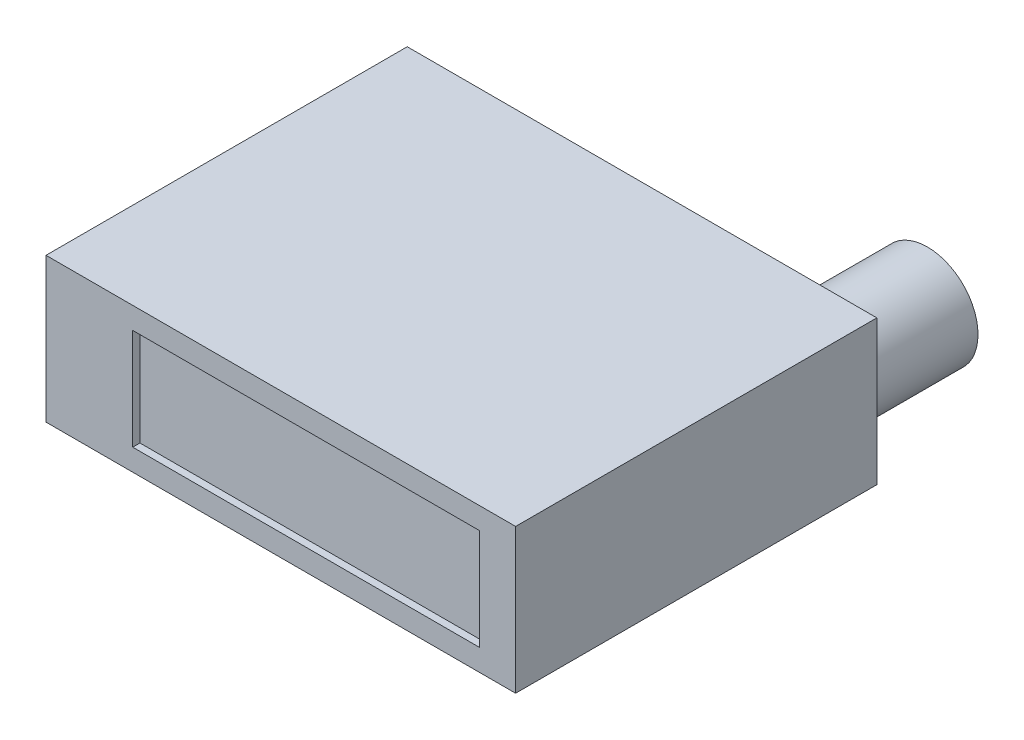
ISO-10303-21;
HEADER;
FILE_DESCRIPTION(('STEP AP214'),'2;1');
FILE_NAME('part.step','',(''),(''),'','','');
FILE_SCHEMA(('AUTOMOTIVE_DESIGN { 1 0 10303 214 1 1 1 1 }'));
ENDSEC;
DATA;
#1=APPLICATION_CONTEXT('core data for automotive mechanical design processes');
#2=APPLICATION_PROTOCOL_DEFINITION('international standard','automotive_design',2000,#1);
#3=PRODUCT_CONTEXT('',#1,'mechanical');
#4=PRODUCT('Part','Part','',(#3));
#5=PRODUCT_RELATED_PRODUCT_CATEGORY('part','',(#4));
#6=PRODUCT_DEFINITION_FORMATION('','',#4);
#7=PRODUCT_DEFINITION_CONTEXT('part definition',#1,'design');
#8=PRODUCT_DEFINITION('design','',#6,#7);
#9=PRODUCT_DEFINITION_SHAPE('','',#8);
#10=(LENGTH_UNIT() NAMED_UNIT(*) SI_UNIT(.MILLI.,.METRE.));
#11=(NAMED_UNIT(*) PLANE_ANGLE_UNIT() SI_UNIT($,.RADIAN.));
#12=(NAMED_UNIT(*) SI_UNIT($,.STERADIAN.) SOLID_ANGLE_UNIT());
#13=UNCERTAINTY_MEASURE_WITH_UNIT(LENGTH_MEASURE(1.E-05),#10,'distance_accuracy_value','');
#14=(GEOMETRIC_REPRESENTATION_CONTEXT(3) GLOBAL_UNCERTAINTY_ASSIGNED_CONTEXT((#13)) GLOBAL_UNIT_ASSIGNED_CONTEXT((#10,
#11,#12)) REPRESENTATION_CONTEXT('',''));
#15=CARTESIAN_POINT('',(0.,0.,0.));
#16=DIRECTION('',(0.,0.,1.));
#17=DIRECTION('',(1.,0.,0.));
#18=AXIS2_PLACEMENT_3D('',#15,#16,#17);
#19=CARTESIAN_POINT('',(32.5,20.,-25.));
#20=DIRECTION('',(-1.,0.,0.));
#21=DIRECTION('',(0.,0.,1.));
#22=AXIS2_PLACEMENT_3D('',#19,#20,#21);
#23=PLANE('',#22);
#24=DIRECTION('',(0.,0.,-1.));
#25=VECTOR('',#24,1.);
#26=CARTESIAN_POINT('',(32.5,0.,-25.));
#27=LINE('',#26,#25);
#28=CARTESIAN_POINT('',(32.5,0.,25.));
#29=VERTEX_POINT('',#28);
#30=CARTESIAN_POINT('',(32.5,0.,-25.));
#31=VERTEX_POINT('',#30);
#32=EDGE_CURVE('E170',#29,#31,#27,.T.);
#33=ORIENTED_EDGE('',*,*,#32,.T.);
#34=DIRECTION('',(0.,-1.,0.));
#35=VECTOR('',#34,1.);
#36=CARTESIAN_POINT('',(32.5,20.,-25.));
#37=LINE('',#36,#35);
#38=CARTESIAN_POINT('',(32.5,20.,-25.));
#39=VERTEX_POINT('',#38);
#40=EDGE_CURVE('E49',#39,#31,#37,.T.);
#41=ORIENTED_EDGE('',*,*,#40,.F.);
#42=DIRECTION('',(0.,0.,-1.));
#43=VECTOR('',#42,1.);
#44=CARTESIAN_POINT('',(32.5,20.,-25.));
#45=LINE('',#44,#43);
#46=CARTESIAN_POINT('',(32.5,20.,25.));
#47=VERTEX_POINT('',#46);
#48=EDGE_CURVE('E171',#47,#39,#45,.T.);
#49=ORIENTED_EDGE('',*,*,#48,.F.);
#50=DIRECTION('',(0.,-1.,0.));
#51=VECTOR('',#50,1.);
#52=CARTESIAN_POINT('',(32.5,20.,25.));
#53=LINE('',#52,#51);
#54=EDGE_CURVE('E181',#47,#29,#53,.T.);
#55=ORIENTED_EDGE('',*,*,#54,.T.);
#56=EDGE_LOOP('',(#33,#41,#49,#55));
#57=FACE_BOUND('',#56,.T.);
#58=ADVANCED_FACE('F41',(#57),#23,.F.);
#59=CARTESIAN_POINT('',(-32.5,20.,-25.));
#60=DIRECTION('',(0.,0.,1.));
#61=DIRECTION('',(1.,0.,0.));
#62=AXIS2_PLACEMENT_3D('',#59,#60,#61);
#63=PLANE('',#62);
#64=CARTESIAN_POINT('',(24.5,10.,-25.));
#65=DIRECTION('',(0.,0.,1.));
#66=DIRECTION('',(1.,0.,0.));
#67=AXIS2_PLACEMENT_3D('',#64,#65,#66);
#68=CIRCLE('',#67,7.);
#69=CARTESIAN_POINT('',(31.5,10.,-25.));
#70=VERTEX_POINT('',#69);
#71=EDGE_CURVE('E11',#70,#70,#68,.F.);
#72=ORIENTED_EDGE('',*,*,#71,.F.);
#73=EDGE_LOOP('',(#72));
#74=FACE_BOUND('',#73,.T.);
#75=DIRECTION('',(-1.,0.,0.));
#76=VECTOR('',#75,1.);
#77=CARTESIAN_POINT('',(-32.5,0.,-25.));
#78=LINE('',#77,#76);
#79=CARTESIAN_POINT('',(-32.5,0.,-25.));
#80=VERTEX_POINT('',#79);
#81=EDGE_CURVE('E185',#31,#80,#78,.T.);
#82=ORIENTED_EDGE('',*,*,#81,.T.);
#83=DIRECTION('',(0.,-1.,0.));
#84=VECTOR('',#83,1.);
#85=CARTESIAN_POINT('',(-32.5,20.,-25.));
#86=LINE('',#85,#84);
#87=CARTESIAN_POINT('',(-32.5,20.,-25.));
#88=VERTEX_POINT('',#87);
#89=EDGE_CURVE('E198',#88,#80,#86,.T.);
#90=ORIENTED_EDGE('',*,*,#89,.F.);
#91=DIRECTION('',(-1.,0.,0.));
#92=VECTOR('',#91,1.);
#93=CARTESIAN_POINT('',(-32.5,20.,-25.));
#94=LINE('',#93,#92);
#95=EDGE_CURVE('E94',#39,#88,#94,.T.);
#96=ORIENTED_EDGE('',*,*,#95,.F.);
#97=ORIENTED_EDGE('',*,*,#40,.T.);
#98=EDGE_LOOP('',(#82,#90,#96,#97));
#99=FACE_BOUND('',#98,.T.);
#100=ADVANCED_FACE('F203',(#74,#99),#63,.F.);
#101=CARTESIAN_POINT('',(-32.5,20.,-25.));
#102=DIRECTION('',(1.,0.,0.));
#103=DIRECTION('',(0.,0.,-1.));
#104=AXIS2_PLACEMENT_3D('',#101,#102,#103);
#105=PLANE('',#104);
#106=DIRECTION('',(0.,0.,1.));
#107=VECTOR('',#106,1.);
#108=CARTESIAN_POINT('',(-32.5,0.,-25.));
#109=LINE('',#108,#107);
#110=CARTESIAN_POINT('',(-32.5,0.,25.));
#111=VERTEX_POINT('',#110);
#112=EDGE_CURVE('E188',#80,#111,#109,.T.);
#113=ORIENTED_EDGE('',*,*,#112,.T.);
#114=DIRECTION('',(0.,-1.,0.));
#115=VECTOR('',#114,1.);
#116=CARTESIAN_POINT('',(-32.5,20.,25.));
#117=LINE('',#116,#115);
#118=CARTESIAN_POINT('',(-32.5,20.,25.));
#119=VERTEX_POINT('',#118);
#120=EDGE_CURVE('E195',#119,#111,#117,.T.);
#121=ORIENTED_EDGE('',*,*,#120,.F.);
#122=DIRECTION('',(0.,0.,1.));
#123=VECTOR('',#122,1.);
#124=CARTESIAN_POINT('',(-32.5,20.,-25.));
#125=LINE('',#124,#123);
#126=EDGE_CURVE('E176',#88,#119,#125,.T.);
#127=ORIENTED_EDGE('',*,*,#126,.F.);
#128=ORIENTED_EDGE('',*,*,#89,.T.);
#129=EDGE_LOOP('',(#113,#121,#127,#128));
#130=FACE_BOUND('',#129,.T.);
#131=ADVANCED_FACE('F212',(#130),#105,.F.);
#132=CARTESIAN_POINT('',(-32.5,20.,25.));
#133=DIRECTION('',(0.,0.,-1.));
#134=DIRECTION('',(-1.,0.,0.));
#135=AXIS2_PLACEMENT_3D('',#132,#133,#134);
#136=PLANE('',#135);
#137=DIRECTION('',(-1.,0.,0.));
#138=VECTOR('',#137,1.);
#139=CARTESIAN_POINT('',(-20.5,17.,25.));
#140=LINE('',#139,#138);
#141=CARTESIAN_POINT('',(27.5,17.,25.));
#142=VERTEX_POINT('',#141);
#143=CARTESIAN_POINT('',(-20.5,17.,25.));
#144=VERTEX_POINT('',#143);
#145=EDGE_CURVE('E152',#142,#144,#140,.T.);
#146=ORIENTED_EDGE('',*,*,#145,.F.);
#147=DIRECTION('',(0.,1.,0.));
#148=VECTOR('',#147,1.);
#149=CARTESIAN_POINT('',(27.5,17.,25.));
#150=LINE('',#149,#148);
#151=CARTESIAN_POINT('',(27.5,3.,25.));
#152=VERTEX_POINT('',#151);
#153=EDGE_CURVE('E56',#152,#142,#150,.T.);
#154=ORIENTED_EDGE('',*,*,#153,.F.);
#155=DIRECTION('',(1.,0.,0.));
#156=VECTOR('',#155,1.);
#157=CARTESIAN_POINT('',(-20.5,3.,25.));
#158=LINE('',#157,#156);
#159=CARTESIAN_POINT('',(-20.5,3.,25.));
#160=VERTEX_POINT('',#159);
#161=EDGE_CURVE('E139',#160,#152,#158,.T.);
#162=ORIENTED_EDGE('',*,*,#161,.F.);
#163=DIRECTION('',(0.,-1.,0.));
#164=VECTOR('',#163,1.);
#165=CARTESIAN_POINT('',(-20.5,17.,25.));
#166=LINE('',#165,#164);
#167=EDGE_CURVE('E143',#144,#160,#166,.T.);
#168=ORIENTED_EDGE('',*,*,#167,.F.);
#169=EDGE_LOOP('',(#146,#154,#162,#168));
#170=FACE_BOUND('',#169,.T.);
#171=DIRECTION('',(1.,0.,0.));
#172=VECTOR('',#171,1.);
#173=CARTESIAN_POINT('',(-32.5,0.,25.));
#174=LINE('',#173,#172);
#175=EDGE_CURVE('E86',#111,#29,#174,.T.);
#176=ORIENTED_EDGE('',*,*,#175,.T.);
#177=ORIENTED_EDGE('',*,*,#54,.F.);
#178=DIRECTION('',(1.,0.,0.));
#179=VECTOR('',#178,1.);
#180=CARTESIAN_POINT('',(-32.5,20.,25.));
#181=LINE('',#180,#179);
#182=EDGE_CURVE('E65',#119,#47,#181,.T.);
#183=ORIENTED_EDGE('',*,*,#182,.F.);
#184=ORIENTED_EDGE('',*,*,#120,.T.);
#185=EDGE_LOOP('',(#176,#177,#183,#184));
#186=FACE_BOUND('',#185,.T.);
#187=ADVANCED_FACE('F214',(#170,#186),#136,.F.);
#188=CARTESIAN_POINT('',(0.,20.,0.));
#189=DIRECTION('',(0.,1.,0.));
#190=DIRECTION('',(0.,0.,1.));
#191=AXIS2_PLACEMENT_3D('',#188,#189,#190);
#192=PLANE('',#191);
#193=ORIENTED_EDGE('',*,*,#48,.T.);
#194=ORIENTED_EDGE('',*,*,#95,.T.);
#195=ORIENTED_EDGE('',*,*,#126,.T.);
#196=ORIENTED_EDGE('',*,*,#182,.T.);
#197=EDGE_LOOP('',(#193,#194,#195,#196));
#198=FACE_BOUND('',#197,.T.);
#199=ADVANCED_FACE('F215',(#198),#192,.T.);
#200=CARTESIAN_POINT('',(0.,0.,0.));
#201=DIRECTION('',(0.,1.,0.));
#202=DIRECTION('',(0.,0.,1.));
#203=AXIS2_PLACEMENT_3D('',#200,#201,#202);
#204=PLANE('',#203);
#205=ORIENTED_EDGE('',*,*,#32,.F.);
#206=ORIENTED_EDGE('',*,*,#175,.F.);
#207=ORIENTED_EDGE('',*,*,#112,.F.);
#208=ORIENTED_EDGE('',*,*,#81,.F.);
#209=EDGE_LOOP('',(#205,#206,#207,#208));
#210=FACE_BOUND('',#209,.T.);
#211=ADVANCED_FACE('F208',(#210),#204,.F.);
#212=CARTESIAN_POINT('',(24.5,10.,-40.));
#213=DIRECTION('',(0.,0.,1.));
#214=DIRECTION('',(1.,0.,0.));
#215=AXIS2_PLACEMENT_3D('',#212,#213,#214);
#216=CYLINDRICAL_SURFACE('',#215,7.);
#217=CARTESIAN_POINT('',(24.5,10.,-40.));
#218=DIRECTION('',(0.,0.,-1.));
#219=DIRECTION('',(-1.,0.,0.));
#220=AXIS2_PLACEMENT_3D('',#217,#218,#219);
#221=CIRCLE('',#220,7.);
#222=CARTESIAN_POINT('',(17.5,10.,-40.));
#223=VERTEX_POINT('',#222);
#224=EDGE_CURVE('E161',#223,#223,#221,.T.);
#225=ORIENTED_EDGE('',*,*,#224,.F.);
#226=EDGE_LOOP('',(#225));
#227=FACE_BOUND('',#226,.T.);
#228=ORIENTED_EDGE('',*,*,#71,.T.);
#229=EDGE_LOOP('',(#228));
#230=FACE_BOUND('',#229,.T.);
#231=ADVANCED_FACE('F222',(#227,#230),#216,.T.);
#232=CARTESIAN_POINT('',(24.5,10.,-40.));
#233=DIRECTION('',(0.,0.,-1.));
#234=DIRECTION('',(-1.,0.,0.));
#235=AXIS2_PLACEMENT_3D('',#232,#233,#234);
#236=PLANE('',#235);
#237=ORIENTED_EDGE('',*,*,#224,.T.);
#238=EDGE_LOOP('',(#237));
#239=FACE_BOUND('',#238,.T.);
#240=ADVANCED_FACE('F239',(#239),#236,.T.);
#241=CARTESIAN_POINT('',(27.5,17.,24.));
#242=DIRECTION('',(1.,0.,0.));
#243=DIRECTION('',(0.,0.,-1.));
#244=AXIS2_PLACEMENT_3D('',#241,#242,#243);
#245=PLANE('',#244);
#246=ORIENTED_EDGE('',*,*,#153,.T.);
#247=DIRECTION('',(0.,0.,1.));
#248=VECTOR('',#247,1.);
#249=CARTESIAN_POINT('',(27.5,17.,24.));
#250=LINE('',#249,#248);
#251=CARTESIAN_POINT('',(27.5,17.,24.));
#252=VERTEX_POINT('',#251);
#253=EDGE_CURVE('E114',#252,#142,#250,.T.);
#254=ORIENTED_EDGE('',*,*,#253,.F.);
#255=DIRECTION('',(0.,1.,0.));
#256=VECTOR('',#255,1.);
#257=CARTESIAN_POINT('',(27.5,17.,24.));
#258=LINE('',#257,#256);
#259=CARTESIAN_POINT('',(27.5,3.,24.));
#260=VERTEX_POINT('',#259);
#261=EDGE_CURVE('E118',#260,#252,#258,.T.);
#262=ORIENTED_EDGE('',*,*,#261,.F.);
#263=DIRECTION('',(0.,0.,1.));
#264=VECTOR('',#263,1.);
#265=CARTESIAN_POINT('',(27.5,3.,24.));
#266=LINE('',#265,#264);
#267=EDGE_CURVE('E158',#260,#152,#266,.T.);
#268=ORIENTED_EDGE('',*,*,#267,.T.);
#269=EDGE_LOOP('',(#246,#254,#262,#268));
#270=FACE_BOUND('',#269,.T.);
#271=ADVANCED_FACE('F116',(#270),#245,.F.);
#272=CARTESIAN_POINT('',(-20.5,3.,24.));
#273=DIRECTION('',(0.,-1.,0.));
#274=DIRECTION('',(0.,0.,-1.));
#275=AXIS2_PLACEMENT_3D('',#272,#273,#274);
#276=PLANE('',#275);
#277=ORIENTED_EDGE('',*,*,#161,.T.);
#278=ORIENTED_EDGE('',*,*,#267,.F.);
#279=DIRECTION('',(1.,0.,0.));
#280=VECTOR('',#279,1.);
#281=CARTESIAN_POINT('',(-20.5,3.,24.));
#282=LINE('',#281,#280);
#283=CARTESIAN_POINT('',(-20.5,3.,24.));
#284=VERTEX_POINT('',#283);
#285=EDGE_CURVE('E125',#284,#260,#282,.T.);
#286=ORIENTED_EDGE('',*,*,#285,.F.);
#287=DIRECTION('',(0.,0.,1.));
#288=VECTOR('',#287,1.);
#289=CARTESIAN_POINT('',(-20.5,3.,24.));
#290=LINE('',#289,#288);
#291=EDGE_CURVE('E162',#284,#160,#290,.T.);
#292=ORIENTED_EDGE('',*,*,#291,.T.);
#293=EDGE_LOOP('',(#277,#278,#286,#292));
#294=FACE_BOUND('',#293,.T.);
#295=ADVANCED_FACE('F250',(#294),#276,.F.);
#296=CARTESIAN_POINT('',(-20.5,17.,24.));
#297=DIRECTION('',(-1.,0.,0.));
#298=DIRECTION('',(0.,-1.,0.));
#299=AXIS2_PLACEMENT_3D('',#296,#297,#298);
#300=PLANE('',#299);
#301=ORIENTED_EDGE('',*,*,#167,.T.);
#302=ORIENTED_EDGE('',*,*,#291,.F.);
#303=DIRECTION('',(0.,-1.,0.));
#304=VECTOR('',#303,1.);
#305=CARTESIAN_POINT('',(-20.5,17.,24.));
#306=LINE('',#305,#304);
#307=CARTESIAN_POINT('',(-20.5,17.,24.));
#308=VERTEX_POINT('',#307);
#309=EDGE_CURVE('E134',#308,#284,#306,.T.);
#310=ORIENTED_EDGE('',*,*,#309,.F.);
#311=DIRECTION('',(0.,0.,1.));
#312=VECTOR('',#311,1.);
#313=CARTESIAN_POINT('',(-20.5,17.,24.));
#314=LINE('',#313,#312);
#315=EDGE_CURVE('E124',#308,#144,#314,.T.);
#316=ORIENTED_EDGE('',*,*,#315,.T.);
#317=EDGE_LOOP('',(#301,#302,#310,#316));
#318=FACE_BOUND('',#317,.T.);
#319=ADVANCED_FACE('F253',(#318),#300,.F.);
#320=CARTESIAN_POINT('',(-20.5,17.,24.));
#321=DIRECTION('',(0.,1.,0.));
#322=DIRECTION('',(0.,0.,1.));
#323=AXIS2_PLACEMENT_3D('',#320,#321,#322);
#324=PLANE('',#323);
#325=ORIENTED_EDGE('',*,*,#145,.T.);
#326=ORIENTED_EDGE('',*,*,#315,.F.);
#327=DIRECTION('',(-1.,0.,0.));
#328=VECTOR('',#327,1.);
#329=CARTESIAN_POINT('',(-20.5,17.,24.));
#330=LINE('',#329,#328);
#331=EDGE_CURVE('E128',#252,#308,#330,.T.);
#332=ORIENTED_EDGE('',*,*,#331,.F.);
#333=ORIENTED_EDGE('',*,*,#253,.T.);
#334=EDGE_LOOP('',(#325,#326,#332,#333));
#335=FACE_BOUND('',#334,.T.);
#336=ADVANCED_FACE('F129',(#335),#324,.F.);
#337=CARTESIAN_POINT('',(0.,0.,24.));
#338=DIRECTION('',(0.,0.,1.));
#339=DIRECTION('',(1.,0.,0.));
#340=AXIS2_PLACEMENT_3D('',#337,#338,#339);
#341=PLANE('',#340);
#342=ORIENTED_EDGE('',*,*,#261,.T.);
#343=ORIENTED_EDGE('',*,*,#331,.T.);
#344=ORIENTED_EDGE('',*,*,#309,.T.);
#345=ORIENTED_EDGE('',*,*,#285,.T.);
#346=EDGE_LOOP('',(#342,#343,#344,#345));
#347=FACE_BOUND('',#346,.T.);
#348=ADVANCED_FACE('F136',(#347),#341,.T.);
#349=CLOSED_SHELL('',(#58,#100,#131,#187,#199,#211,#231,#240,#271,#295,#319,#336,#348));
#350=MANIFOLD_SOLID_BREP('B2',#349);
#351=ADVANCED_BREP_SHAPE_REPRESENTATION('',(#18,#350),#14);
#352=SHAPE_DEFINITION_REPRESENTATION(#9,#351);
ENDSEC;
END-ISO-10303-21;
